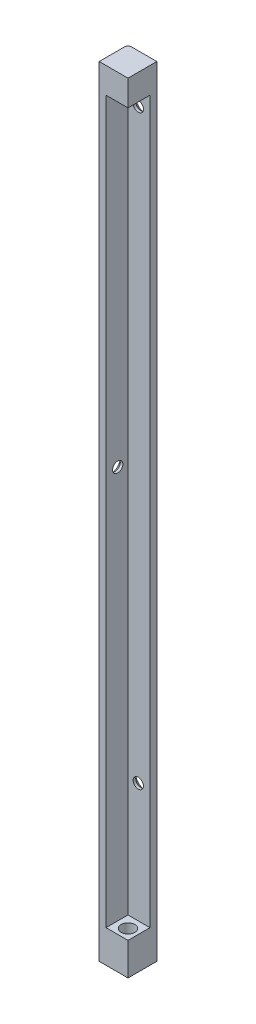
ISO-10303-21;
HEADER;
FILE_DESCRIPTION(('STEP AP214'),'2;1');
FILE_NAME('part.step','',(''),(''),'','','');
FILE_SCHEMA(('AUTOMOTIVE_DESIGN { 1 0 10303 214 1 1 1 1 }'));
ENDSEC;
DATA;
#1=APPLICATION_CONTEXT('core data for automotive mechanical design processes');
#2=APPLICATION_PROTOCOL_DEFINITION('international standard','automotive_design',2000,#1);
#3=PRODUCT_CONTEXT('',#1,'mechanical');
#4=PRODUCT('Part','Part','',(#3));
#5=PRODUCT_RELATED_PRODUCT_CATEGORY('part','',(#4));
#6=PRODUCT_DEFINITION_FORMATION('','',#4);
#7=PRODUCT_DEFINITION_CONTEXT('part definition',#1,'design');
#8=PRODUCT_DEFINITION('design','',#6,#7);
#9=PRODUCT_DEFINITION_SHAPE('','',#8);
#10=(LENGTH_UNIT() NAMED_UNIT(*) SI_UNIT(.MILLI.,.METRE.));
#11=(NAMED_UNIT(*) PLANE_ANGLE_UNIT() SI_UNIT($,.RADIAN.));
#12=(NAMED_UNIT(*) SI_UNIT($,.STERADIAN.) SOLID_ANGLE_UNIT());
#13=UNCERTAINTY_MEASURE_WITH_UNIT(LENGTH_MEASURE(1.E-05),#10,'distance_accuracy_value','');
#14=(GEOMETRIC_REPRESENTATION_CONTEXT(3) GLOBAL_UNCERTAINTY_ASSIGNED_CONTEXT((#13)) GLOBAL_UNIT_ASSIGNED_CONTEXT((#10,
#11,#12)) REPRESENTATION_CONTEXT('',''));
#15=CARTESIAN_POINT('',(0.,0.,0.));
#16=DIRECTION('',(0.,0.,1.));
#17=DIRECTION('',(1.,0.,0.));
#18=AXIS2_PLACEMENT_3D('',#15,#16,#17);
#19=CARTESIAN_POINT('',(2.,221.5,0.));
#20=DIRECTION('',(-1.,0.,0.));
#21=DIRECTION('',(0.,0.,1.));
#22=AXIS2_PLACEMENT_3D('',#19,#20,#21);
#23=PLANE('',#22);
#24=CARTESIAN_POINT('',(2.,120.,-4.));
#25=DIRECTION('',(-1.,0.,0.));
#26=DIRECTION('',(0.,0.,1.));
#27=AXIS2_PLACEMENT_3D('',#24,#25,#26);
#28=CIRCLE('',#27,1.5);
#29=CARTESIAN_POINT('',(2.,120.,-2.5));
#30=VERTEX_POINT('',#29);
#31=EDGE_CURVE('E202',#30,#30,#28,.T.);
#32=ORIENTED_EDGE('',*,*,#31,.T.);
#33=EDGE_LOOP('',(#32));
#34=FACE_BOUND('',#33,.T.);
#35=DIRECTION('',(0.,0.,1.));
#36=VECTOR('',#35,1.);
#37=CARTESIAN_POINT('',(2.,215.5,0.));
#38=LINE('',#37,#36);
#39=CARTESIAN_POINT('',(2.,215.5,-7.));
#40=VERTEX_POINT('',#39);
#41=CARTESIAN_POINT('',(2.,215.5,-0.599999999999999));
#42=VERTEX_POINT('',#41);
#43=EDGE_CURVE('E175',#40,#42,#38,.T.);
#44=ORIENTED_EDGE('',*,*,#43,.T.);
#45=DIRECTION('',(0.,-1.,0.));
#46=VECTOR('',#45,1.);
#47=CARTESIAN_POINT('',(2.,221.5,-0.6));
#48=LINE('',#47,#46);
#49=CARTESIAN_POINT('',(2.,5.50000000000001,-0.599999999999973));
#50=VERTEX_POINT('',#49);
#51=EDGE_CURVE('E170',#42,#50,#48,.T.);
#52=ORIENTED_EDGE('',*,*,#51,.T.);
#53=DIRECTION('',(0.,0.,-1.));
#54=VECTOR('',#53,1.);
#55=CARTESIAN_POINT('',(2.,5.50000000000001,0.));
#56=LINE('',#55,#54);
#57=CARTESIAN_POINT('',(2.,5.50000000000001,-7.));
#58=VERTEX_POINT('',#57);
#59=EDGE_CURVE('E57',#50,#58,#56,.T.);
#60=ORIENTED_EDGE('',*,*,#59,.T.);
#61=DIRECTION('',(0.,-1.,0.));
#62=VECTOR('',#61,1.);
#63=CARTESIAN_POINT('',(2.,221.5,-7.));
#64=LINE('',#63,#62);
#65=EDGE_CURVE('E203',#40,#58,#64,.T.);
#66=ORIENTED_EDGE('',*,*,#65,.F.);
#67=EDGE_LOOP('',(#44,#52,#60,#66));
#68=FACE_BOUND('',#67,.T.);
#69=ADVANCED_FACE('F35',(#34,#68),#23,.F.);
#70=CARTESIAN_POINT('',(2.,221.5,-7.));
#71=DIRECTION('',(0.,0.,-1.));
#72=DIRECTION('',(-1.,0.,0.));
#73=AXIS2_PLACEMENT_3D('',#70,#71,#72);
#74=PLANE('',#73);
#75=CARTESIAN_POINT('',(5.,40.25,-7.));
#76=DIRECTION('',(0.,0.,-1.));
#77=DIRECTION('',(-1.,0.,0.));
#78=AXIS2_PLACEMENT_3D('',#75,#76,#77);
#79=CIRCLE('',#78,1.5);
#80=CARTESIAN_POINT('',(3.5,40.25,-7.));
#81=VERTEX_POINT('',#80);
#82=EDGE_CURVE('E188',#81,#81,#79,.T.);
#83=ORIENTED_EDGE('',*,*,#82,.T.);
#84=EDGE_LOOP('',(#83));
#85=FACE_BOUND('',#84,.T.);
#86=CARTESIAN_POINT('',(5.00000000000108,211.,-7.));
#87=DIRECTION('',(0.,0.,-1.));
#88=DIRECTION('',(-1.,0.,0.));
#89=AXIS2_PLACEMENT_3D('',#86,#87,#88);
#90=CIRCLE('',#89,1.5);
#91=CARTESIAN_POINT('',(3.50000000000108,211.,-7.));
#92=VERTEX_POINT('',#91);
#93=EDGE_CURVE('E195',#92,#92,#90,.T.);
#94=ORIENTED_EDGE('',*,*,#93,.T.);
#95=EDGE_LOOP('',(#94));
#96=FACE_BOUND('',#95,.T.);
#97=DIRECTION('',(1.,0.,0.));
#98=VECTOR('',#97,1.);
#99=CARTESIAN_POINT('',(1.,5.5,-7.));
#100=LINE('',#99,#98);
#101=CARTESIAN_POINT('',(8.4,5.50000000000001,-7.));
#102=VERTEX_POINT('',#101);
#103=EDGE_CURVE('E178',#58,#102,#100,.T.);
#104=ORIENTED_EDGE('',*,*,#103,.T.);
#105=DIRECTION('',(0.,1.,0.));
#106=VECTOR('',#105,1.);
#107=CARTESIAN_POINT('',(8.40000000000003,221.5,-7.));
#108=LINE('',#107,#106);
#109=CARTESIAN_POINT('',(8.40000000000003,215.5,-7.));
#110=VERTEX_POINT('',#109);
#111=EDGE_CURVE('E164',#102,#110,#108,.T.);
#112=ORIENTED_EDGE('',*,*,#111,.T.);
#113=DIRECTION('',(-1.,0.,0.));
#114=VECTOR('',#113,1.);
#115=CARTESIAN_POINT('',(2.,215.5,-7.));
#116=LINE('',#115,#114);
#117=EDGE_CURVE('E50',#110,#40,#116,.T.);
#118=ORIENTED_EDGE('',*,*,#117,.T.);
#119=ORIENTED_EDGE('',*,*,#65,.T.);
#120=EDGE_LOOP('',(#104,#112,#118,#119));
#121=FACE_BOUND('',#120,.T.);
#122=ADVANCED_FACE('F227',(#85,#96,#121),#74,.F.);
#123=CARTESIAN_POINT('',(0.,221.5,-9.));
#124=DIRECTION('',(0.,0.,1.));
#125=DIRECTION('',(1.,0.,0.));
#126=AXIS2_PLACEMENT_3D('',#123,#124,#125);
#127=PLANE('',#126);
#128=CARTESIAN_POINT('',(5.,40.25,-9.));
#129=DIRECTION('',(0.,0.,-1.));
#130=DIRECTION('',(-1.,0.,0.));
#131=AXIS2_PLACEMENT_3D('',#128,#129,#130);
#132=CIRCLE('',#131,2.75);
#133=CARTESIAN_POINT('',(2.25,40.25,-9.));
#134=VERTEX_POINT('',#133);
#135=EDGE_CURVE('E182',#134,#134,#132,.T.);
#136=ORIENTED_EDGE('',*,*,#135,.F.);
#137=EDGE_LOOP('',(#136));
#138=FACE_BOUND('',#137,.T.);
#139=CARTESIAN_POINT('',(5.00000000000108,211.,-9.));
#140=DIRECTION('',(0.,0.,-1.));
#141=DIRECTION('',(-1.,0.,0.));
#142=AXIS2_PLACEMENT_3D('',#139,#140,#141);
#143=CIRCLE('',#142,2.75);
#144=CARTESIAN_POINT('',(2.25000000000108,211.,-9.));
#145=VERTEX_POINT('',#144);
#146=EDGE_CURVE('E189',#145,#145,#143,.T.);
#147=ORIENTED_EDGE('',*,*,#146,.F.);
#148=EDGE_LOOP('',(#147));
#149=FACE_BOUND('',#148,.T.);
#150=DIRECTION('',(0.,1.,0.));
#151=VECTOR('',#150,1.);
#152=CARTESIAN_POINT('',(8.40000000000003,222.,-9.));
#153=LINE('',#152,#151);
#154=CARTESIAN_POINT('',(8.4,-4.,-9.));
#155=VERTEX_POINT('',#154);
#156=CARTESIAN_POINT('',(8.4,223.,-9.));
#157=VERTEX_POINT('',#156);
#158=EDGE_CURVE('E159',#155,#157,#153,.T.);
#159=ORIENTED_EDGE('',*,*,#158,.F.);
#160=DIRECTION('',(1.,0.,0.));
#161=VECTOR('',#160,1.);
#162=CARTESIAN_POINT('',(8.4,-4.,-9.));
#163=LINE('',#162,#161);
#164=CARTESIAN_POINT('',(1.,-4.,-9.));
#165=VERTEX_POINT('',#164);
#166=EDGE_CURVE('E148',#165,#155,#163,.T.);
#167=ORIENTED_EDGE('',*,*,#166,.F.);
#168=DIRECTION('',(0.,1.,0.));
#169=VECTOR('',#168,1.);
#170=CARTESIAN_POINT('',(1.,221.5,-9.));
#171=LINE('',#170,#169);
#172=CARTESIAN_POINT('',(1.,223.,-9.));
#173=VERTEX_POINT('',#172);
#174=EDGE_CURVE('E43',#165,#173,#171,.T.);
#175=ORIENTED_EDGE('',*,*,#174,.T.);
#176=DIRECTION('',(-1.,0.,0.));
#177=VECTOR('',#176,1.);
#178=CARTESIAN_POINT('',(8.4,223.,-9.));
#179=LINE('',#178,#177);
#180=EDGE_CURVE('E138',#157,#173,#179,.T.);
#181=ORIENTED_EDGE('',*,*,#180,.F.);
#182=EDGE_LOOP('',(#159,#167,#175,#181));
#183=FACE_BOUND('',#182,.T.);
#184=ADVANCED_FACE('F213',(#138,#149,#183),#127,.F.);
#185=CARTESIAN_POINT('',(0.,221.5,0.));
#186=DIRECTION('',(1.,0.,0.));
#187=DIRECTION('',(0.,0.,-1.));
#188=AXIS2_PLACEMENT_3D('',#185,#186,#187);
#189=PLANE('',#188);
#190=CARTESIAN_POINT('',(0.,120.,-4.));
#191=DIRECTION('',(-1.,0.,0.));
#192=DIRECTION('',(0.,0.,1.));
#193=AXIS2_PLACEMENT_3D('',#190,#191,#192);
#194=CIRCLE('',#193,2.75);
#195=CARTESIAN_POINT('',(0.,120.,-1.25));
#196=VERTEX_POINT('',#195);
#197=EDGE_CURVE('E196',#196,#196,#194,.T.);
#198=ORIENTED_EDGE('',*,*,#197,.F.);
#199=EDGE_LOOP('',(#198));
#200=FACE_BOUND('',#199,.T.);
#201=DIRECTION('',(0.,-1.,0.));
#202=VECTOR('',#201,1.);
#203=CARTESIAN_POINT('',(0.,224.,-0.6));
#204=LINE('',#203,#202);
#205=CARTESIAN_POINT('',(0.,223.,-0.6));
#206=VERTEX_POINT('',#205);
#207=CARTESIAN_POINT('',(0.,-4.,-0.599999999999973));
#208=VERTEX_POINT('',#207);
#209=EDGE_CURVE('E107',#206,#208,#204,.T.);
#210=ORIENTED_EDGE('',*,*,#209,.F.);
#211=DIRECTION('',(0.,0.,1.));
#212=VECTOR('',#211,1.);
#213=CARTESIAN_POINT('',(0.,223.,-7.99999999999999));
#214=LINE('',#213,#212);
#215=CARTESIAN_POINT('',(0.,223.,-7.99999999999999));
#216=VERTEX_POINT('',#215);
#217=EDGE_CURVE('E111',#216,#206,#214,.T.);
#218=ORIENTED_EDGE('',*,*,#217,.F.);
#219=DIRECTION('',(0.,1.,0.));
#220=VECTOR('',#219,1.);
#221=CARTESIAN_POINT('',(0.,221.5,-8.));
#222=LINE('',#221,#220);
#223=CARTESIAN_POINT('',(0.,-4.,-8.));
#224=VERTEX_POINT('',#223);
#225=EDGE_CURVE('E11',#216,#224,#222,.F.);
#226=ORIENTED_EDGE('',*,*,#225,.T.);
#227=DIRECTION('',(0.,0.,-1.));
#228=VECTOR('',#227,1.);
#229=CARTESIAN_POINT('',(0.,-4.,-0.599999999999973));
#230=LINE('',#229,#228);
#231=EDGE_CURVE('E113',#208,#224,#230,.T.);
#232=ORIENTED_EDGE('',*,*,#231,.F.);
#233=EDGE_LOOP('',(#210,#218,#226,#232));
#234=FACE_BOUND('',#233,.T.);
#235=ADVANCED_FACE('F109',(#200,#234),#189,.F.);
#236=CARTESIAN_POINT('',(0.,120.,-4.));
#237=DIRECTION('',(-1.,0.,0.));
#238=DIRECTION('',(0.,0.,1.));
#239=AXIS2_PLACEMENT_3D('',#236,#237,#238);
#240=CYLINDRICAL_SURFACE('',#239,1.5);
#241=CARTESIAN_POINT('',(1.25,120.,-4.));
#242=DIRECTION('',(-1.,0.,0.));
#243=DIRECTION('',(0.,0.,1.));
#244=AXIS2_PLACEMENT_3D('',#241,#242,#243);
#245=CIRCLE('',#244,1.5);
#246=CARTESIAN_POINT('',(1.25,120.,-2.5));
#247=VERTEX_POINT('',#246);
#248=EDGE_CURVE('E199',#247,#247,#245,.T.);
#249=ORIENTED_EDGE('',*,*,#248,.T.);
#250=EDGE_LOOP('',(#249));
#251=FACE_BOUND('',#250,.T.);
#252=ORIENTED_EDGE('',*,*,#31,.F.);
#253=EDGE_LOOP('',(#252));
#254=FACE_BOUND('',#253,.T.);
#255=ADVANCED_FACE('F257',(#251,#254),#240,.F.);
#256=CARTESIAN_POINT('',(0.,120.,-4.));
#257=DIRECTION('',(-1.,0.,0.));
#258=DIRECTION('',(0.,0.,1.));
#259=AXIS2_PLACEMENT_3D('',#256,#257,#258);
#260=CONICAL_SURFACE('',#259,2.75,0.785398163397449);
#261=ORIENTED_EDGE('',*,*,#248,.F.);
#262=EDGE_LOOP('',(#261));
#263=FACE_BOUND('',#262,.T.);
#264=ORIENTED_EDGE('',*,*,#197,.T.);
#265=EDGE_LOOP('',(#264));
#266=FACE_BOUND('',#265,.T.);
#267=ADVANCED_FACE('F261',(#263,#266),#260,.F.);
#268=CARTESIAN_POINT('',(5.00000000000108,211.,-9.));
#269=DIRECTION('',(0.,0.,-1.));
#270=DIRECTION('',(-1.,0.,0.));
#271=AXIS2_PLACEMENT_3D('',#268,#269,#270);
#272=CYLINDRICAL_SURFACE('',#271,1.5);
#273=CARTESIAN_POINT('',(5.00000000000108,211.,-7.75));
#274=DIRECTION('',(0.,0.,-1.));
#275=DIRECTION('',(-1.,0.,0.));
#276=AXIS2_PLACEMENT_3D('',#273,#274,#275);
#277=CIRCLE('',#276,1.5);
#278=CARTESIAN_POINT('',(3.50000000000108,211.,-7.75));
#279=VERTEX_POINT('',#278);
#280=EDGE_CURVE('E192',#279,#279,#277,.T.);
#281=ORIENTED_EDGE('',*,*,#280,.T.);
#282=EDGE_LOOP('',(#281));
#283=FACE_BOUND('',#282,.T.);
#284=ORIENTED_EDGE('',*,*,#93,.F.);
#285=EDGE_LOOP('',(#284));
#286=FACE_BOUND('',#285,.T.);
#287=ADVANCED_FACE('F265',(#283,#286),#272,.F.);
#288=CARTESIAN_POINT('',(5.00000000000108,211.,-9.));
#289=DIRECTION('',(0.,0.,-1.));
#290=DIRECTION('',(-1.,0.,0.));
#291=AXIS2_PLACEMENT_3D('',#288,#289,#290);
#292=CONICAL_SURFACE('',#291,2.75,0.785398163397449);
#293=ORIENTED_EDGE('',*,*,#280,.F.);
#294=EDGE_LOOP('',(#293));
#295=FACE_BOUND('',#294,.T.);
#296=ORIENTED_EDGE('',*,*,#146,.T.);
#297=EDGE_LOOP('',(#296));
#298=FACE_BOUND('',#297,.T.);
#299=ADVANCED_FACE('F269',(#295,#298),#292,.F.);
#300=CARTESIAN_POINT('',(5.,40.25,-9.));
#301=DIRECTION('',(0.,0.,-1.));
#302=DIRECTION('',(-1.,0.,0.));
#303=AXIS2_PLACEMENT_3D('',#300,#301,#302);
#304=CYLINDRICAL_SURFACE('',#303,1.5);
#305=CARTESIAN_POINT('',(5.,40.25,-7.75));
#306=DIRECTION('',(0.,0.,-1.));
#307=DIRECTION('',(-1.,0.,0.));
#308=AXIS2_PLACEMENT_3D('',#305,#306,#307);
#309=CIRCLE('',#308,1.5);
#310=CARTESIAN_POINT('',(3.5,40.25,-7.75));
#311=VERTEX_POINT('',#310);
#312=EDGE_CURVE('E185',#311,#311,#309,.T.);
#313=ORIENTED_EDGE('',*,*,#312,.T.);
#314=EDGE_LOOP('',(#313));
#315=FACE_BOUND('',#314,.T.);
#316=ORIENTED_EDGE('',*,*,#82,.F.);
#317=EDGE_LOOP('',(#316));
#318=FACE_BOUND('',#317,.T.);
#319=ADVANCED_FACE('F273',(#315,#318),#304,.F.);
#320=CARTESIAN_POINT('',(5.,40.25,-9.));
#321=DIRECTION('',(0.,0.,-1.));
#322=DIRECTION('',(-1.,0.,0.));
#323=AXIS2_PLACEMENT_3D('',#320,#321,#322);
#324=CONICAL_SURFACE('',#323,2.75,0.785398163397449);
#325=ORIENTED_EDGE('',*,*,#312,.F.);
#326=EDGE_LOOP('',(#325));
#327=FACE_BOUND('',#326,.T.);
#328=ORIENTED_EDGE('',*,*,#135,.T.);
#329=EDGE_LOOP('',(#328));
#330=FACE_BOUND('',#329,.T.);
#331=ADVANCED_FACE('F241',(#327,#330),#324,.F.);
#332=CARTESIAN_POINT('',(0.,5.5,0.));
#333=DIRECTION('',(0.,1.,0.));
#334=DIRECTION('',(0.,0.,1.));
#335=AXIS2_PLACEMENT_3D('',#332,#333,#334);
#336=PLANE('',#335);
#337=CARTESIAN_POINT('',(5.39999999999917,5.5,-3.60000000000187));
#338=DIRECTION('',(0.,1.,0.));
#339=DIRECTION('',(0.,0.,1.));
#340=AXIS2_PLACEMENT_3D('',#337,#338,#339);
#341=CIRCLE('',#340,2.);
#342=CARTESIAN_POINT('',(5.39999999999917,5.5,-1.60000000000187));
#343=VERTEX_POINT('',#342);
#344=EDGE_CURVE('E156',#343,#343,#341,.T.);
#345=ORIENTED_EDGE('',*,*,#344,.F.);
#346=EDGE_LOOP('',(#345));
#347=FACE_BOUND('',#346,.T.);
#348=DIRECTION('',(0.,0.,1.));
#349=VECTOR('',#348,1.);
#350=CARTESIAN_POINT('',(8.4,5.5,0.));
#351=LINE('',#350,#349);
#352=CARTESIAN_POINT('',(8.4,5.5,-0.599999999999973));
#353=VERTEX_POINT('',#352);
#354=EDGE_CURVE('E166',#102,#353,#351,.T.);
#355=ORIENTED_EDGE('',*,*,#354,.F.);
#356=ORIENTED_EDGE('',*,*,#103,.F.);
#357=ORIENTED_EDGE('',*,*,#59,.F.);
#358=DIRECTION('',(-1.,0.,0.));
#359=VECTOR('',#358,1.);
#360=CARTESIAN_POINT('',(0.,5.5,-0.599999999999973));
#361=LINE('',#360,#359);
#362=EDGE_CURVE('E172',#353,#50,#361,.T.);
#363=ORIENTED_EDGE('',*,*,#362,.F.);
#364=EDGE_LOOP('',(#355,#356,#357,#363));
#365=FACE_BOUND('',#364,.T.);
#366=ADVANCED_FACE('F226',(#347,#365),#336,.T.);
#367=CARTESIAN_POINT('',(0.,215.5,0.));
#368=DIRECTION('',(0.,-1.,0.));
#369=DIRECTION('',(0.,0.,-1.));
#370=AXIS2_PLACEMENT_3D('',#367,#368,#369);
#371=PLANE('',#370);
#372=DIRECTION('',(0.,0.,-1.));
#373=VECTOR('',#372,1.);
#374=CARTESIAN_POINT('',(8.40000000000003,215.5,0.));
#375=LINE('',#374,#373);
#376=CARTESIAN_POINT('',(8.40000000000003,215.5,-0.599999999999999));
#377=VERTEX_POINT('',#376);
#378=EDGE_CURVE('E162',#377,#110,#375,.T.);
#379=ORIENTED_EDGE('',*,*,#378,.F.);
#380=DIRECTION('',(1.,0.,0.));
#381=VECTOR('',#380,1.);
#382=CARTESIAN_POINT('',(0.,215.5,-0.599999999999999));
#383=LINE('',#382,#381);
#384=EDGE_CURVE('E117',#42,#377,#383,.T.);
#385=ORIENTED_EDGE('',*,*,#384,.F.);
#386=ORIENTED_EDGE('',*,*,#43,.F.);
#387=ORIENTED_EDGE('',*,*,#117,.F.);
#388=EDGE_LOOP('',(#379,#385,#386,#387));
#389=FACE_BOUND('',#388,.T.);
#390=ADVANCED_FACE('F232',(#389),#371,.T.);
#391=CARTESIAN_POINT('',(10.,224.,-0.6));
#392=DIRECTION('',(0.,0.,-1.));
#393=DIRECTION('',(0.,1.,0.));
#394=AXIS2_PLACEMENT_3D('',#391,#392,#393);
#395=PLANE('',#394);
#396=ORIENTED_EDGE('',*,*,#209,.T.);
#397=DIRECTION('',(-1.,0.,0.));
#398=VECTOR('',#397,1.);
#399=CARTESIAN_POINT('',(0.,-4.,-0.599999999999973));
#400=LINE('',#399,#398);
#401=CARTESIAN_POINT('',(8.4,-4.,-0.599999999999972));
#402=VERTEX_POINT('',#401);
#403=EDGE_CURVE('E154',#402,#208,#400,.T.);
#404=ORIENTED_EDGE('',*,*,#403,.F.);
#405=DIRECTION('',(0.,1.,0.));
#406=VECTOR('',#405,1.);
#407=CARTESIAN_POINT('',(8.40000000000003,224.,-0.6));
#408=LINE('',#407,#406);
#409=EDGE_CURVE('E118',#402,#353,#408,.T.);
#410=ORIENTED_EDGE('',*,*,#409,.T.);
#411=ORIENTED_EDGE('',*,*,#362,.T.);
#412=ORIENTED_EDGE('',*,*,#51,.F.);
#413=ORIENTED_EDGE('',*,*,#384,.T.);
#414=CARTESIAN_POINT('',(8.40000000000003,223.,-0.6));
#415=VERTEX_POINT('',#414);
#416=EDGE_CURVE('E124',#377,#415,#408,.T.);
#417=ORIENTED_EDGE('',*,*,#416,.T.);
#418=DIRECTION('',(1.,0.,0.));
#419=VECTOR('',#418,1.);
#420=CARTESIAN_POINT('',(0.,223.,-0.6));
#421=LINE('',#420,#419);
#422=EDGE_CURVE('E121',#206,#415,#421,.T.);
#423=ORIENTED_EDGE('',*,*,#422,.F.);
#424=EDGE_LOOP('',(#396,#404,#410,#411,#412,#413,#417,#423));
#425=FACE_BOUND('',#424,.T.);
#426=ADVANCED_FACE('F122',(#425),#395,.F.);
#427=CARTESIAN_POINT('',(8.40000000000003,222.,1.));
#428=DIRECTION('',(-1.,0.,0.));
#429=DIRECTION('',(0.,-1.,0.));
#430=AXIS2_PLACEMENT_3D('',#427,#428,#429);
#431=PLANE('',#430);
#432=ORIENTED_EDGE('',*,*,#409,.F.);
#433=DIRECTION('',(0.,0.,1.));
#434=VECTOR('',#433,1.);
#435=CARTESIAN_POINT('',(8.4,-4.,-0.599999999999972));
#436=LINE('',#435,#434);
#437=EDGE_CURVE('E151',#155,#402,#436,.T.);
#438=ORIENTED_EDGE('',*,*,#437,.F.);
#439=ORIENTED_EDGE('',*,*,#158,.T.);
#440=DIRECTION('',(0.,0.,-1.));
#441=VECTOR('',#440,1.);
#442=CARTESIAN_POINT('',(8.40000000000003,223.,-0.6));
#443=LINE('',#442,#441);
#444=EDGE_CURVE('E128',#415,#157,#443,.T.);
#445=ORIENTED_EDGE('',*,*,#444,.F.);
#446=ORIENTED_EDGE('',*,*,#416,.F.);
#447=ORIENTED_EDGE('',*,*,#378,.T.);
#448=ORIENTED_EDGE('',*,*,#111,.F.);
#449=ORIENTED_EDGE('',*,*,#354,.T.);
#450=EDGE_LOOP('',(#432,#438,#439,#445,#446,#447,#448,#449));
#451=FACE_BOUND('',#450,.T.);
#452=ADVANCED_FACE('F223',(#451),#431,.F.);
#453=CARTESIAN_POINT('',(5.39999999999917,0.499999999999997,-3.60000000000187));
#454=DIRECTION('',(0.,-1.,0.));
#455=DIRECTION('',(0.,0.,-1.));
#456=AXIS2_PLACEMENT_3D('',#453,#454,#455);
#457=CYLINDRICAL_SURFACE('',#456,2.);
#458=ORIENTED_EDGE('',*,*,#344,.T.);
#459=EDGE_LOOP('',(#458));
#460=FACE_BOUND('',#459,.T.);
#461=CARTESIAN_POINT('',(5.39999999999916,-4.,-3.60000000000188));
#462=DIRECTION('',(0.,-1.,0.));
#463=DIRECTION('',(0.,0.,-1.));
#464=AXIS2_PLACEMENT_3D('',#461,#462,#463);
#465=CIRCLE('',#464,2.00000000000001);
#466=CARTESIAN_POINT('',(5.39999999999916,-4.,-5.60000000000189));
#467=VERTEX_POINT('',#466);
#468=EDGE_CURVE('E141',#467,#467,#465,.T.);
#469=ORIENTED_EDGE('',*,*,#468,.T.);
#470=EDGE_LOOP('',(#469));
#471=FACE_BOUND('',#470,.T.);
#472=ADVANCED_FACE('F308',(#460,#471),#457,.F.);
#473=CARTESIAN_POINT('',(1.,221.5,-8.));
#474=DIRECTION('',(0.,1.,0.));
#475=DIRECTION('',(0.,0.,1.));
#476=AXIS2_PLACEMENT_3D('',#473,#474,#475);
#477=CYLINDRICAL_SURFACE('',#476,1.);
#478=ORIENTED_EDGE('',*,*,#174,.F.);
#479=CARTESIAN_POINT('',(0.999999999999998,-4.,-8.));
#480=DIRECTION('',(0.,-1.,0.));
#481=DIRECTION('',(0.,0.,-1.));
#482=AXIS2_PLACEMENT_3D('',#479,#480,#481);
#483=CIRCLE('',#482,0.999999999999998);
#484=EDGE_CURVE('E145',#224,#165,#483,.T.);
#485=ORIENTED_EDGE('',*,*,#484,.F.);
#486=ORIENTED_EDGE('',*,*,#225,.F.);
#487=CARTESIAN_POINT('',(1.,223.,-8.));
#488=DIRECTION('',(0.,1.,0.));
#489=DIRECTION('',(0.,0.,-1.));
#490=AXIS2_PLACEMENT_3D('',#487,#488,#489);
#491=CIRCLE('',#490,1.);
#492=EDGE_CURVE('E134',#173,#216,#491,.T.);
#493=ORIENTED_EDGE('',*,*,#492,.F.);
#494=EDGE_LOOP('',(#478,#485,#486,#493));
#495=FACE_BOUND('',#494,.T.);
#496=ADVANCED_FACE('F37',(#495),#477,.T.);
#497=CARTESIAN_POINT('',(0.999999999999998,-4.,-8.));
#498=DIRECTION('',(0.,-1.,0.));
#499=DIRECTION('',(0.,0.,-1.));
#500=AXIS2_PLACEMENT_3D('',#497,#498,#499);
#501=PLANE('',#500);
#502=ORIENTED_EDGE('',*,*,#231,.T.);
#503=ORIENTED_EDGE('',*,*,#484,.T.);
#504=ORIENTED_EDGE('',*,*,#166,.T.);
#505=ORIENTED_EDGE('',*,*,#437,.T.);
#506=ORIENTED_EDGE('',*,*,#403,.T.);
#507=EDGE_LOOP('',(#502,#503,#504,#505,#506));
#508=FACE_BOUND('',#507,.T.);
#509=ORIENTED_EDGE('',*,*,#468,.F.);
#510=EDGE_LOOP('',(#509));
#511=FACE_BOUND('',#510,.T.);
#512=ADVANCED_FACE('F217',(#508,#511),#501,.T.);
#513=CARTESIAN_POINT('',(1.,223.,-8.));
#514=DIRECTION('',(0.,-1.,0.));
#515=DIRECTION('',(0.,0.,-1.));
#516=AXIS2_PLACEMENT_3D('',#513,#514,#515);
#517=PLANE('',#516);
#518=ORIENTED_EDGE('',*,*,#217,.T.);
#519=ORIENTED_EDGE('',*,*,#422,.T.);
#520=ORIENTED_EDGE('',*,*,#444,.T.);
#521=ORIENTED_EDGE('',*,*,#180,.T.);
#522=ORIENTED_EDGE('',*,*,#492,.T.);
#523=EDGE_LOOP('',(#518,#519,#520,#521,#522));
#524=FACE_BOUND('',#523,.T.);
#525=ADVANCED_FACE('F131',(#524),#517,.F.);
#526=CLOSED_SHELL('',(#69,#122,#184,#235,#255,#267,#287,#299,#319,#331,#366,#390,#426,#452,#472,
#496,#512,#525));
#527=MANIFOLD_SOLID_BREP('B2',#526);
#528=ADVANCED_BREP_SHAPE_REPRESENTATION('',(#18,#527),#14);
#529=SHAPE_DEFINITION_REPRESENTATION(#9,#528);
ENDSEC;
END-ISO-10303-21;
